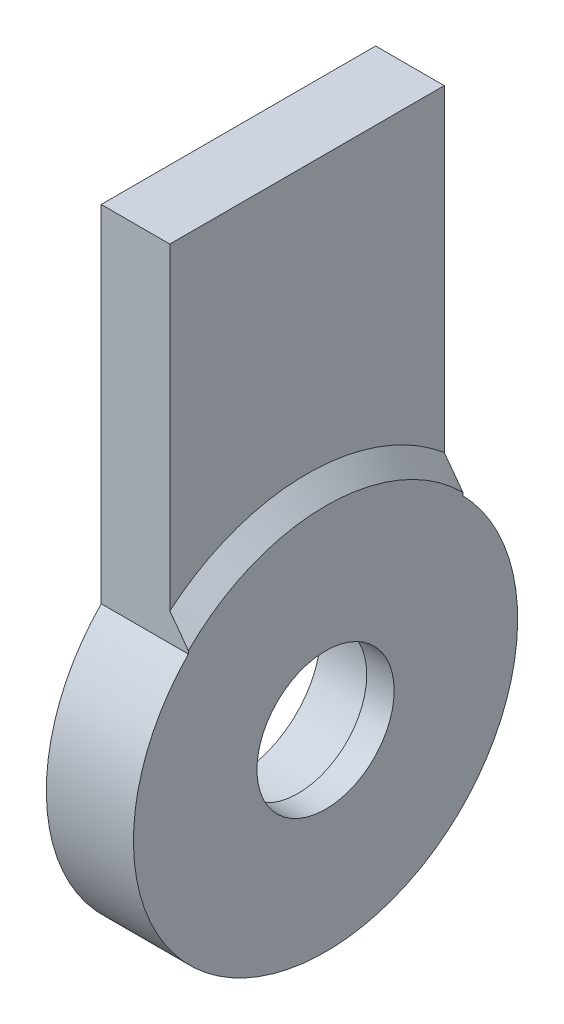
ISO-10303-21;
HEADER;
FILE_DESCRIPTION(('STEP AP214'),'2;1');
FILE_NAME('part.step','',(''),(''),'','','');
FILE_SCHEMA(('AUTOMOTIVE_DESIGN { 1 0 10303 214 1 1 1 1 }'));
ENDSEC;
DATA;
#1=APPLICATION_CONTEXT('core data for automotive mechanical design processes');
#2=APPLICATION_PROTOCOL_DEFINITION('international standard','automotive_design',2000,#1);
#3=PRODUCT_CONTEXT('',#1,'mechanical');
#4=PRODUCT('Part','Part','',(#3));
#5=PRODUCT_RELATED_PRODUCT_CATEGORY('part','',(#4));
#6=PRODUCT_DEFINITION_FORMATION('','',#4);
#7=PRODUCT_DEFINITION_CONTEXT('part definition',#1,'design');
#8=PRODUCT_DEFINITION('design','',#6,#7);
#9=PRODUCT_DEFINITION_SHAPE('','',#8);
#10=(LENGTH_UNIT() NAMED_UNIT(*) SI_UNIT(.MILLI.,.METRE.));
#11=(NAMED_UNIT(*) PLANE_ANGLE_UNIT() SI_UNIT($,.RADIAN.));
#12=(NAMED_UNIT(*) SI_UNIT($,.STERADIAN.) SOLID_ANGLE_UNIT());
#13=UNCERTAINTY_MEASURE_WITH_UNIT(LENGTH_MEASURE(1.E-05),#10,'distance_accuracy_value','');
#14=(GEOMETRIC_REPRESENTATION_CONTEXT(3) GLOBAL_UNCERTAINTY_ASSIGNED_CONTEXT((#13)) GLOBAL_UNIT_ASSIGNED_CONTEXT((#10,
#11,#12)) REPRESENTATION_CONTEXT('',''));
#15=CARTESIAN_POINT('',(0.,0.,0.));
#16=DIRECTION('',(0.,0.,1.));
#17=DIRECTION('',(1.,0.,0.));
#18=AXIS2_PLACEMENT_3D('',#15,#16,#17);
#19=CARTESIAN_POINT('',(-3.175,0.,0.));
#20=DIRECTION('',(1.,0.,0.));
#21=DIRECTION('',(0.,0.,-1.));
#22=AXIS2_PLACEMENT_3D('',#19,#20,#21);
#23=PLANE('',#22);
#24=CARTESIAN_POINT('',(-3.175,0.,0.));
#25=DIRECTION('',(-1.,0.,0.));
#26=DIRECTION('',(0.,0.,1.));
#27=AXIS2_PLACEMENT_3D('',#24,#25,#26);
#28=CIRCLE('',#27,6.);
#29=CARTESIAN_POINT('',(-3.175,0.,6.));
#30=VERTEX_POINT('',#29);
#31=EDGE_CURVE('E117',#30,#30,#28,.T.);
#32=ORIENTED_EDGE('',*,*,#31,.F.);
#33=EDGE_LOOP('',(#32));
#34=FACE_BOUND('',#33,.T.);
#35=CARTESIAN_POINT('',(-3.175,0.,0.));
#36=DIRECTION('',(-1.,0.,0.));
#37=DIRECTION('',(0.,0.,1.));
#38=AXIS2_PLACEMENT_3D('',#35,#36,#37);
#39=CIRCLE('',#38,7.5);
#40=CARTESIAN_POINT('',(-3.175,0.,7.5));
#41=VERTEX_POINT('',#40);
#42=EDGE_CURVE('E248',#41,#41,#39,.T.);
#43=ORIENTED_EDGE('',*,*,#42,.T.);
#44=EDGE_LOOP('',(#43));
#45=FACE_BOUND('',#44,.T.);
#46=ADVANCED_FACE('F51',(#34,#45),#23,.F.);
#47=CARTESIAN_POINT('',(3.175,0.,0.));
#48=DIRECTION('',(1.,0.,0.));
#49=DIRECTION('',(0.,0.,-1.));
#50=AXIS2_PLACEMENT_3D('',#47,#48,#49);
#51=PLANE('',#50);
#52=CARTESIAN_POINT('',(3.175,0.,0.));
#53=DIRECTION('',(1.,0.,0.));
#54=DIRECTION('',(0.,0.,-1.));
#55=AXIS2_PLACEMENT_3D('',#52,#53,#54);
#56=CIRCLE('',#55,5.);
#57=CARTESIAN_POINT('',(3.175,0.,-5.));
#58=VERTEX_POINT('',#57);
#59=EDGE_CURVE('E148',#58,#58,#56,.T.);
#60=ORIENTED_EDGE('',*,*,#59,.F.);
#61=EDGE_LOOP('',(#60));
#62=FACE_BOUND('',#61,.T.);
#63=DIRECTION('',(0.,1.,0.));
#64=VECTOR('',#63,1.);
#65=CARTESIAN_POINT('',(3.175,35.,-10.));
#66=LINE('',#65,#64);
#67=CARTESIAN_POINT('',(3.175,9.79795897113272,-9.99999999999999));
#68=VERTEX_POINT('',#67);
#69=CARTESIAN_POINT('',(3.175,10.0111188185937,-9.99999999999999));
#70=VERTEX_POINT('',#69);
#71=EDGE_CURVE('E62',#68,#70,#66,.T.);
#72=ORIENTED_EDGE('',*,*,#71,.T.);
#73=CARTESIAN_POINT('',(3.175,0.,0.));
#74=DIRECTION('',(1.,0.,0.));
#75=DIRECTION('',(0.,0.,-1.));
#76=AXIS2_PLACEMENT_3D('',#73,#74,#75);
#77=CIRCLE('',#76,14.15);
#78=CARTESIAN_POINT('',(3.175,10.0111188185937,9.99999999999999));
#79=VERTEX_POINT('',#78);
#80=EDGE_CURVE('E69',#70,#79,#77,.T.);
#81=ORIENTED_EDGE('',*,*,#80,.T.);
#82=DIRECTION('',(0.,-1.,0.));
#83=VECTOR('',#82,1.);
#84=CARTESIAN_POINT('',(3.175,35.,10.));
#85=LINE('',#84,#83);
#86=CARTESIAN_POINT('',(3.175,9.79795897113272,9.99999999999999));
#87=VERTEX_POINT('',#86);
#88=EDGE_CURVE('E12',#87,#79,#85,.F.);
#89=ORIENTED_EDGE('',*,*,#88,.F.);
#90=CARTESIAN_POINT('',(3.175,0.,0.));
#91=DIRECTION('',(1.,0.,0.));
#92=DIRECTION('',(0.,0.,-1.));
#93=AXIS2_PLACEMENT_3D('',#90,#91,#92);
#94=CIRCLE('',#93,14.);
#95=EDGE_CURVE('E205',#87,#68,#94,.T.);
#96=ORIENTED_EDGE('',*,*,#95,.T.);
#97=EDGE_LOOP('',(#72,#81,#89,#96));
#98=FACE_BOUND('',#97,.T.);
#99=ADVANCED_FACE('F165',(#62,#98),#51,.T.);
#100=CARTESIAN_POINT('',(3.175,35.,-10.));
#101=DIRECTION('',(0.,0.,1.));
#102=DIRECTION('',(0.,-1.,0.));
#103=AXIS2_PLACEMENT_3D('',#100,#101,#102);
#104=PLANE('',#103);
#105=DIRECTION('',(0.,1.,0.));
#106=VECTOR('',#105,1.);
#107=CARTESIAN_POINT('',(1.825,35.,-10.));
#108=LINE('',#107,#106);
#109=CARTESIAN_POINT('',(1.825,11.842719282327,-9.99999999999999));
#110=VERTEX_POINT('',#109);
#111=CARTESIAN_POINT('',(1.825,35.,-10.));
#112=VERTEX_POINT('',#111);
#113=EDGE_CURVE('E107',#110,#112,#108,.T.);
#114=ORIENTED_EDGE('',*,*,#113,.F.);
#115=CARTESIAN_POINT('',(1.825,11.842719282327,-9.99999999999999));
#116=CARTESIAN_POINT('',(1.95331352474725,11.6747736055109,-9.99999999999999));
#117=CARTESIAN_POINT('',(2.0809167707226,11.5062829784768,-9.99999999999999));
#118=CARTESIAN_POINT('',(2.33451876158086,11.1681274572329,-9.99999999999999));
#119=CARTESIAN_POINT('',(2.46051767897232,10.9984626923549,-9.99999999999999));
#120=CARTESIAN_POINT('',(2.71075702577823,10.6578353530853,-9.99999999999999));
#121=CARTESIAN_POINT('',(2.83499742632644,10.4868727574603,-9.99999999999999));
#122=CARTESIAN_POINT('',(3.08152190813871,10.1435152956513,-9.99999999999999));
#123=CARTESIAN_POINT('',(3.20380577565603,9.971120276062,-9.99999999999999));
#124=CARTESIAN_POINT('',(3.32500000000001,9.79795897113272,-9.99999999999999));
#125=B_SPLINE_CURVE_WITH_KNOTS('',3,(#115,#116,#117,#118,#119,#120,#121,#122,#123,#124),
.UNSPECIFIED.,.F.,.F.,(4,2,2,2,4),(0.,0.634059848317505,1.26805093236118,1.90205241139826,
2.53612268711523),.UNSPECIFIED.);
#126=EDGE_CURVE('E76',#110,#70,#125,.T.);
#127=ORIENTED_EDGE('',*,*,#126,.T.);
#128=ORIENTED_EDGE('',*,*,#71,.F.);
#129=DIRECTION('',(-1.,0.,0.));
#130=VECTOR('',#129,1.);
#131=CARTESIAN_POINT('',(3.175,9.79795897113272,-9.99999999999999));
#132=LINE('',#131,#130);
#133=CARTESIAN_POINT('',(-3.175,9.79795897113272,-9.99999999999999));
#134=VERTEX_POINT('',#133);
#135=EDGE_CURVE('E134',#68,#134,#132,.T.);
#136=ORIENTED_EDGE('',*,*,#135,.T.);
#137=DIRECTION('',(0.,1.,0.));
#138=VECTOR('',#137,1.);
#139=CARTESIAN_POINT('',(-3.175,35.,-10.));
#140=LINE('',#139,#138);
#141=CARTESIAN_POINT('',(-3.175,35.,-10.));
#142=VERTEX_POINT('',#141);
#143=EDGE_CURVE('E131',#134,#142,#140,.T.);
#144=ORIENTED_EDGE('',*,*,#143,.T.);
#145=DIRECTION('',(-1.,0.,0.));
#146=VECTOR('',#145,1.);
#147=CARTESIAN_POINT('',(3.175,35.,-10.));
#148=LINE('',#147,#146);
#149=EDGE_CURVE('E123',#112,#142,#148,.T.);
#150=ORIENTED_EDGE('',*,*,#149,.F.);
#151=EDGE_LOOP('',(#114,#127,#128,#136,#144,#150));
#152=FACE_BOUND('',#151,.T.);
#153=ADVANCED_FACE('F129',(#152),#104,.F.);
#154=CARTESIAN_POINT('',(3.175,35.,10.));
#155=DIRECTION('',(0.,-1.,0.));
#156=DIRECTION('',(0.,0.,-1.));
#157=AXIS2_PLACEMENT_3D('',#154,#155,#156);
#158=PLANE('',#157);
#159=DIRECTION('',(0.,0.,1.));
#160=VECTOR('',#159,1.);
#161=CARTESIAN_POINT('',(1.825,35.,10.));
#162=LINE('',#161,#160);
#163=CARTESIAN_POINT('',(1.825,35.,10.));
#164=VERTEX_POINT('',#163);
#165=EDGE_CURVE('E111',#112,#164,#162,.T.);
#166=ORIENTED_EDGE('',*,*,#165,.F.);
#167=ORIENTED_EDGE('',*,*,#149,.T.);
#168=DIRECTION('',(0.,0.,1.));
#169=VECTOR('',#168,1.);
#170=CARTESIAN_POINT('',(-3.175,35.,10.));
#171=LINE('',#170,#169);
#172=CARTESIAN_POINT('',(-3.175,35.,10.));
#173=VERTEX_POINT('',#172);
#174=EDGE_CURVE('E216',#142,#173,#171,.T.);
#175=ORIENTED_EDGE('',*,*,#174,.T.);
#176=DIRECTION('',(-1.,0.,0.));
#177=VECTOR('',#176,1.);
#178=CARTESIAN_POINT('',(3.175,35.,10.));
#179=LINE('',#178,#177);
#180=EDGE_CURVE('E125',#164,#173,#179,.T.);
#181=ORIENTED_EDGE('',*,*,#180,.F.);
#182=EDGE_LOOP('',(#166,#167,#175,#181));
#183=FACE_BOUND('',#182,.T.);
#184=ADVANCED_FACE('F121',(#183),#158,.F.);
#185=CARTESIAN_POINT('',(3.175,35.,10.));
#186=DIRECTION('',(0.,0.,-1.));
#187=DIRECTION('',(0.,1.,0.));
#188=AXIS2_PLACEMENT_3D('',#185,#186,#187);
#189=PLANE('',#188);
#190=DIRECTION('',(0.,-1.,0.));
#191=VECTOR('',#190,1.);
#192=CARTESIAN_POINT('',(1.825,35.,10.));
#193=LINE('',#192,#191);
#194=CARTESIAN_POINT('',(1.825,11.842719282327,9.99999999999999));
#195=VERTEX_POINT('',#194);
#196=EDGE_CURVE('E138',#164,#195,#193,.T.);
#197=ORIENTED_EDGE('',*,*,#196,.F.);
#198=ORIENTED_EDGE('',*,*,#180,.T.);
#199=DIRECTION('',(0.,-1.,0.));
#200=VECTOR('',#199,1.);
#201=CARTESIAN_POINT('',(-3.175,35.,10.));
#202=LINE('',#201,#200);
#203=CARTESIAN_POINT('',(-3.175,9.79795897113272,9.99999999999999));
#204=VERTEX_POINT('',#203);
#205=EDGE_CURVE('E212',#173,#204,#202,.T.);
#206=ORIENTED_EDGE('',*,*,#205,.T.);
#207=DIRECTION('',(-1.,0.,0.));
#208=VECTOR('',#207,1.);
#209=CARTESIAN_POINT('',(3.175,9.79795897113272,9.99999999999999));
#210=LINE('',#209,#208);
#211=EDGE_CURVE('E140',#87,#204,#210,.T.);
#212=ORIENTED_EDGE('',*,*,#211,.F.);
#213=ORIENTED_EDGE('',*,*,#88,.T.);
#214=CARTESIAN_POINT('',(3.32500000000001,9.79795897113272,9.99999999999999));
#215=CARTESIAN_POINT('',(3.20380577565602,9.971120276062,9.99999999999999));
#216=CARTESIAN_POINT('',(3.08152190813871,10.1435152956513,9.99999999999999));
#217=CARTESIAN_POINT('',(2.83499742632644,10.4868727574603,9.99999999999999));
#218=CARTESIAN_POINT('',(2.71075702577823,10.6578353530853,9.99999999999999));
#219=CARTESIAN_POINT('',(2.46051767897232,10.9984626923549,9.99999999999999));
#220=CARTESIAN_POINT('',(2.33451876158086,11.1681274572329,9.99999999999999));
#221=CARTESIAN_POINT('',(2.0809167707226,11.5062829784768,9.99999999999999));
#222=CARTESIAN_POINT('',(1.95331352474725,11.6747736055109,9.99999999999999));
#223=CARTESIAN_POINT('',(1.825,11.842719282327,9.99999999999999));
#224=B_SPLINE_CURVE_WITH_KNOTS('',3,(#214,#215,#216,#217,#218,#219,#220,#221,#222,#223),
.UNSPECIFIED.,.F.,.F.,(4,2,2,2,4),(0.,0.634070275716975,1.26807175475405,1.90206283879772,
2.53612268711523),.UNSPECIFIED.);
#225=EDGE_CURVE('E196',#79,#195,#224,.T.);
#226=ORIENTED_EDGE('',*,*,#225,.T.);
#227=EDGE_LOOP('',(#197,#198,#206,#212,#213,#226));
#228=FACE_BOUND('',#227,.T.);
#229=ADVANCED_FACE('F181',(#228),#189,.F.);
#230=CARTESIAN_POINT('',(-3.175,0.,0.));
#231=DIRECTION('',(-1.,0.,0.));
#232=DIRECTION('',(0.,0.,1.));
#233=AXIS2_PLACEMENT_3D('',#230,#231,#232);
#234=CIRCLE('',#233,12.);
#235=CARTESIAN_POINT('',(-3.175,0.,12.));
#236=VERTEX_POINT('',#235);
#237=EDGE_CURVE('E240',#236,#236,#234,.T.);
#238=ORIENTED_EDGE('',*,*,#237,.F.);
#239=EDGE_LOOP('',(#238));
#240=FACE_BOUND('',#239,.T.);
#241=CARTESIAN_POINT('',(-3.175,0.,0.));
#242=DIRECTION('',(1.,0.,0.));
#243=DIRECTION('',(0.,0.,-1.));
#244=AXIS2_PLACEMENT_3D('',#241,#242,#243);
#245=CIRCLE('',#244,14.);
#246=EDGE_CURVE('E221',#204,#134,#245,.T.);
#247=ORIENTED_EDGE('',*,*,#246,.F.);
#248=ORIENTED_EDGE('',*,*,#205,.F.);
#249=ORIENTED_EDGE('',*,*,#174,.F.);
#250=ORIENTED_EDGE('',*,*,#143,.F.);
#251=EDGE_LOOP('',(#247,#248,#249,#250));
#252=FACE_BOUND('',#251,.T.);
#253=ADVANCED_FACE('F170',(#240,#252),#23,.F.);
#254=CARTESIAN_POINT('',(3.175,0.,0.));
#255=DIRECTION('',(-1.,0.,0.));
#256=DIRECTION('',(0.,0.,1.));
#257=AXIS2_PLACEMENT_3D('',#254,#255,#256);
#258=CYLINDRICAL_SURFACE('',#257,14.);
#259=ORIENTED_EDGE('',*,*,#135,.F.);
#260=ORIENTED_EDGE('',*,*,#95,.F.);
#261=ORIENTED_EDGE('',*,*,#211,.T.);
#262=ORIENTED_EDGE('',*,*,#246,.T.);
#263=EDGE_LOOP('',(#259,#260,#261,#262));
#264=FACE_BOUND('',#263,.T.);
#265=ADVANCED_FACE('F167',(#264),#258,.T.);
#266=CARTESIAN_POINT('',(3.175,0.,0.));
#267=DIRECTION('',(-1.,0.,0.));
#268=DIRECTION('',(0.,0.,1.));
#269=AXIS2_PLACEMENT_3D('',#266,#267,#268);
#270=CYLINDRICAL_SURFACE('',#269,5.);
#271=CARTESIAN_POINT('',(1.175,0.,0.));
#272=DIRECTION('',(1.,0.,0.));
#273=DIRECTION('',(0.,0.,-1.));
#274=AXIS2_PLACEMENT_3D('',#271,#272,#273);
#275=CIRCLE('',#274,5.);
#276=CARTESIAN_POINT('',(1.175,0.,-5.));
#277=VERTEX_POINT('',#276);
#278=EDGE_CURVE('E144',#277,#277,#275,.T.);
#279=ORIENTED_EDGE('',*,*,#278,.F.);
#280=EDGE_LOOP('',(#279));
#281=FACE_BOUND('',#280,.T.);
#282=ORIENTED_EDGE('',*,*,#59,.T.);
#283=EDGE_LOOP('',(#282));
#284=FACE_BOUND('',#283,.T.);
#285=ADVANCED_FACE('F169',(#281,#284),#270,.F.);
#286=CARTESIAN_POINT('',(1.175,0.,0.));
#287=DIRECTION('',(1.,0.,0.));
#288=DIRECTION('',(0.,0.,-1.));
#289=AXIS2_PLACEMENT_3D('',#286,#287,#288);
#290=PLANE('',#289);
#291=ORIENTED_EDGE('',*,*,#278,.T.);
#292=EDGE_LOOP('',(#291));
#293=FACE_BOUND('',#292,.T.);
#294=CARTESIAN_POINT('',(1.175,0.,0.));
#295=DIRECTION('',(1.,0.,0.));
#296=DIRECTION('',(0.,0.,-1.));
#297=AXIS2_PLACEMENT_3D('',#294,#295,#296);
#298=CIRCLE('',#297,6.);
#299=CARTESIAN_POINT('',(1.175,0.,-6.));
#300=VERTEX_POINT('',#299);
#301=EDGE_CURVE('E149',#300,#300,#298,.F.);
#302=ORIENTED_EDGE('',*,*,#301,.T.);
#303=EDGE_LOOP('',(#302));
#304=FACE_BOUND('',#303,.T.);
#305=ADVANCED_FACE('F177',(#293,#304),#290,.F.);
#306=CARTESIAN_POINT('',(20.1455627484771,0.,0.));
#307=DIRECTION('',(-1.,0.,0.));
#308=DIRECTION('',(0.,0.,1.));
#309=AXIS2_PLACEMENT_3D('',#306,#307,#308);
#310=CYLINDRICAL_SURFACE('',#309,6.);
#311=ORIENTED_EDGE('',*,*,#31,.T.);
#312=EDGE_LOOP('',(#311));
#313=FACE_BOUND('',#312,.T.);
#314=ORIENTED_EDGE('',*,*,#301,.F.);
#315=EDGE_LOOP('',(#314));
#316=FACE_BOUND('',#315,.T.);
#317=ADVANCED_FACE('F270',(#313,#316),#310,.F.);
#318=CARTESIAN_POINT('',(1.825,0.,0.));
#319=DIRECTION('',(1.,0.,0.));
#320=DIRECTION('',(0.,0.,-1.));
#321=AXIS2_PLACEMENT_3D('',#318,#319,#320);
#322=PLANE('',#321);
#323=ORIENTED_EDGE('',*,*,#196,.T.);
#324=CARTESIAN_POINT('',(1.825,0.,0.));
#325=DIRECTION('',(1.,0.,0.));
#326=DIRECTION('',(0.,0.,-1.));
#327=AXIS2_PLACEMENT_3D('',#324,#325,#326);
#328=CIRCLE('',#327,15.5);
#329=EDGE_CURVE('E114',#195,#110,#328,.F.);
#330=ORIENTED_EDGE('',*,*,#329,.T.);
#331=ORIENTED_EDGE('',*,*,#113,.T.);
#332=ORIENTED_EDGE('',*,*,#165,.T.);
#333=EDGE_LOOP('',(#323,#330,#331,#332));
#334=FACE_BOUND('',#333,.T.);
#335=ADVANCED_FACE('F110',(#334),#322,.T.);
#336=CARTESIAN_POINT('',(1.825,0.,0.));
#337=DIRECTION('',(-1.,0.,0.));
#338=DIRECTION('',(0.,0.,1.));
#339=AXIS2_PLACEMENT_3D('',#336,#337,#338);
#340=CONICAL_SURFACE('',#339,15.5,0.785398163397453);
#341=ORIENTED_EDGE('',*,*,#225,.F.);
#342=ORIENTED_EDGE('',*,*,#80,.F.);
#343=ORIENTED_EDGE('',*,*,#126,.F.);
#344=ORIENTED_EDGE('',*,*,#329,.F.);
#345=EDGE_LOOP('',(#341,#342,#343,#344));
#346=FACE_BOUND('',#345,.T.);
#347=ADVANCED_FACE('F54',(#346),#340,.T.);
#348=CARTESIAN_POINT('',(-2.425,0.,0.));
#349=DIRECTION('',(-1.,0.,0.));
#350=DIRECTION('',(0.,0.,1.));
#351=AXIS2_PLACEMENT_3D('',#348,#349,#350);
#352=CYLINDRICAL_SURFACE('',#351,12.);
#353=CARTESIAN_POINT('',(-2.425,0.,0.));
#354=DIRECTION('',(-1.,0.,0.));
#355=DIRECTION('',(0.,0.,1.));
#356=AXIS2_PLACEMENT_3D('',#353,#354,#355);
#357=CIRCLE('',#356,12.);
#358=CARTESIAN_POINT('',(-2.425,0.,12.));
#359=VERTEX_POINT('',#358);
#360=EDGE_CURVE('E127',#359,#359,#357,.T.);
#361=ORIENTED_EDGE('',*,*,#360,.F.);
#362=EDGE_LOOP('',(#361));
#363=FACE_BOUND('',#362,.T.);
#364=ORIENTED_EDGE('',*,*,#237,.T.);
#365=EDGE_LOOP('',(#364));
#366=FACE_BOUND('',#365,.T.);
#367=ADVANCED_FACE('F262',(#363,#366),#352,.F.);
#368=CARTESIAN_POINT('',(-2.425,0.,0.));
#369=DIRECTION('',(-1.,0.,0.));
#370=DIRECTION('',(0.,0.,1.));
#371=AXIS2_PLACEMENT_3D('',#368,#369,#370);
#372=PLANE('',#371);
#373=CARTESIAN_POINT('',(-2.425,0.,0.));
#374=DIRECTION('',(-1.,0.,0.));
#375=DIRECTION('',(0.,0.,1.));
#376=AXIS2_PLACEMENT_3D('',#373,#374,#375);
#377=CIRCLE('',#376,7.5);
#378=CARTESIAN_POINT('',(-2.425,0.,7.5));
#379=VERTEX_POINT('',#378);
#380=EDGE_CURVE('E244',#379,#379,#377,.T.);
#381=ORIENTED_EDGE('',*,*,#380,.F.);
#382=EDGE_LOOP('',(#381));
#383=FACE_BOUND('',#382,.T.);
#384=ORIENTED_EDGE('',*,*,#360,.T.);
#385=EDGE_LOOP('',(#384));
#386=FACE_BOUND('',#385,.T.);
#387=ADVANCED_FACE('F256',(#383,#386),#372,.T.);
#388=CARTESIAN_POINT('',(-2.425,0.,0.));
#389=DIRECTION('',(-1.,0.,0.));
#390=DIRECTION('',(0.,0.,1.));
#391=AXIS2_PLACEMENT_3D('',#388,#389,#390);
#392=CYLINDRICAL_SURFACE('',#391,7.5);
#393=ORIENTED_EDGE('',*,*,#380,.T.);
#394=EDGE_LOOP('',(#393));
#395=FACE_BOUND('',#394,.T.);
#396=ORIENTED_EDGE('',*,*,#42,.F.);
#397=EDGE_LOOP('',(#396));
#398=FACE_BOUND('',#397,.T.);
#399=ADVANCED_FACE('F254',(#395,#398),#392,.T.);
#400=CLOSED_SHELL('',(#46,#99,#153,#184,#229,#253,#265,#285,#305,#317,#335,#347,#367,#387,#399));
#401=MANIFOLD_SOLID_BREP('B2',#400);
#402=ADVANCED_BREP_SHAPE_REPRESENTATION('',(#18,#401),#14);
#403=SHAPE_DEFINITION_REPRESENTATION(#9,#402);
ENDSEC;
END-ISO-10303-21;
